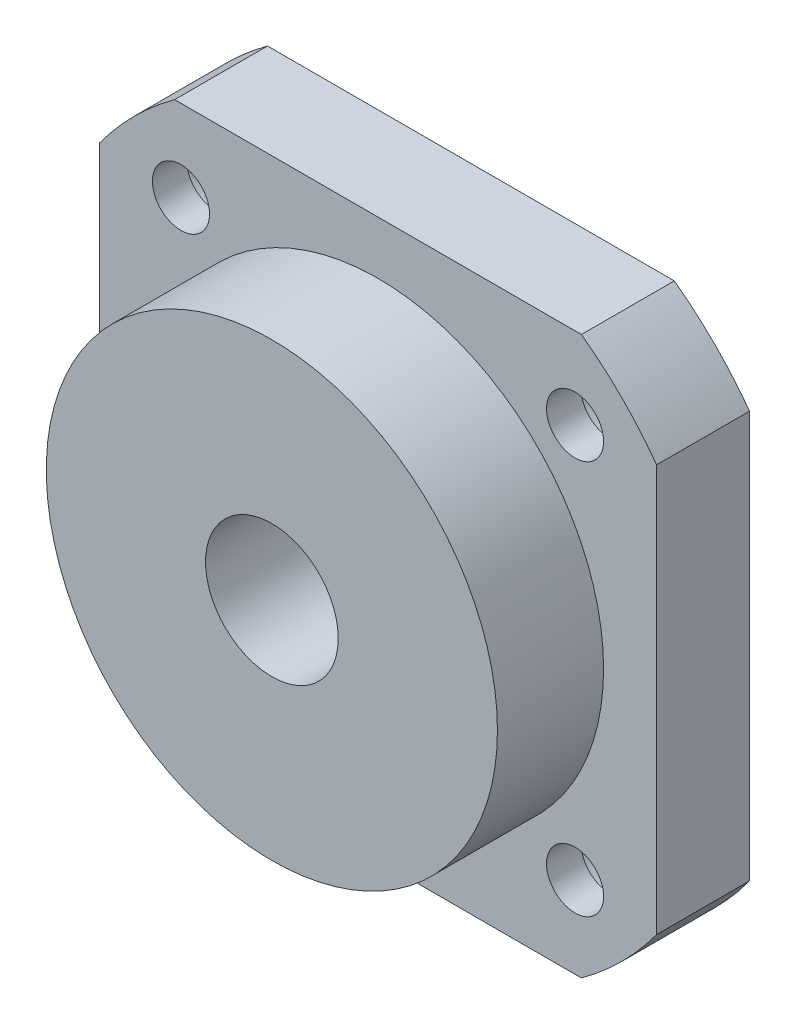
ISO-10303-21;
HEADER;
FILE_DESCRIPTION(('STEP AP214'),'2;1');
FILE_NAME('part.step','',(''),(''),'','','');
FILE_SCHEMA(('AUTOMOTIVE_DESIGN { 1 0 10303 214 1 1 1 1 }'));
ENDSEC;
DATA;
#1=APPLICATION_CONTEXT('core data for automotive mechanical design processes');
#2=APPLICATION_PROTOCOL_DEFINITION('international standard','automotive_design',2000,#1);
#3=PRODUCT_CONTEXT('',#1,'mechanical');
#4=PRODUCT('Part','Part','',(#3));
#5=PRODUCT_RELATED_PRODUCT_CATEGORY('part','',(#4));
#6=PRODUCT_DEFINITION_FORMATION('','',#4);
#7=PRODUCT_DEFINITION_CONTEXT('part definition',#1,'design');
#8=PRODUCT_DEFINITION('design','',#6,#7);
#9=PRODUCT_DEFINITION_SHAPE('','',#8);
#10=(LENGTH_UNIT() NAMED_UNIT(*) SI_UNIT(.MILLI.,.METRE.));
#11=(NAMED_UNIT(*) PLANE_ANGLE_UNIT() SI_UNIT($,.RADIAN.));
#12=(NAMED_UNIT(*) SI_UNIT($,.STERADIAN.) SOLID_ANGLE_UNIT());
#13=UNCERTAINTY_MEASURE_WITH_UNIT(LENGTH_MEASURE(1.E-05),#10,'distance_accuracy_value','');
#14=(GEOMETRIC_REPRESENTATION_CONTEXT(3) GLOBAL_UNCERTAINTY_ASSIGNED_CONTEXT((#13)) GLOBAL_UNIT_ASSIGNED_CONTEXT((#10,
#11,#12)) REPRESENTATION_CONTEXT('',''));
#15=CARTESIAN_POINT('',(0.,0.,0.));
#16=DIRECTION('',(0.,0.,1.));
#17=DIRECTION('',(1.,0.,0.));
#18=AXIS2_PLACEMENT_3D('',#15,#16,#17);
#19=CARTESIAN_POINT('',(0.,0.,15.));
#20=DIRECTION('',(0.,0.,1.));
#21=DIRECTION('',(1.,0.,0.));
#22=AXIS2_PLACEMENT_3D('',#19,#20,#21);
#23=PLANE('',#22);
#24=CARTESIAN_POINT('',(0.,0.,15.));
#25=DIRECTION('',(0.,0.,1.));
#26=DIRECTION('',(1.,0.,0.));
#27=AXIS2_PLACEMENT_3D('',#24,#25,#26);
#28=CIRCLE('',#27,5.);
#29=CARTESIAN_POINT('',(5.,0.,15.));
#30=VERTEX_POINT('',#29);
#31=EDGE_CURVE('E189',#30,#30,#28,.T.);
#32=ORIENTED_EDGE('',*,*,#31,.F.);
#33=EDGE_LOOP('',(#32));
#34=FACE_BOUND('',#33,.T.);
#35=CARTESIAN_POINT('',(0.,0.,15.));
#36=DIRECTION('',(0.,0.,1.));
#37=DIRECTION('',(1.,0.,0.));
#38=AXIS2_PLACEMENT_3D('',#35,#36,#37);
#39=CIRCLE('',#38,17.);
#40=CARTESIAN_POINT('',(17.,0.,15.));
#41=VERTEX_POINT('',#40);
#42=EDGE_CURVE('E138',#41,#41,#39,.T.);
#43=ORIENTED_EDGE('',*,*,#42,.T.);
#44=EDGE_LOOP('',(#43));
#45=FACE_BOUND('',#44,.T.);
#46=ADVANCED_FACE('F39',(#34,#45),#23,.T.);
#47=CARTESIAN_POINT('',(0.,0.,15.));
#48=DIRECTION('',(0.,0.,-1.));
#49=DIRECTION('',(-1.,0.,0.));
#50=AXIS2_PLACEMENT_3D('',#47,#48,#49);
#51=CYLINDRICAL_SURFACE('',#50,26.);
#52=CARTESIAN_POINT('',(0.,0.,7.));
#53=DIRECTION('',(0.,0.,1.));
#54=DIRECTION('',(1.,0.,0.));
#55=AXIS2_PLACEMENT_3D('',#52,#53,#54);
#56=CIRCLE('',#55,26.);
#57=CARTESIAN_POINT('',(21.,15.3297097167559,7.));
#58=VERTEX_POINT('',#57);
#59=CARTESIAN_POINT('',(15.3297097167559,21.,7.));
#60=VERTEX_POINT('',#59);
#61=EDGE_CURVE('E105',#58,#60,#56,.T.);
#62=ORIENTED_EDGE('',*,*,#61,.F.);
#63=DIRECTION('',(0.,0.,-1.));
#64=VECTOR('',#63,1.);
#65=CARTESIAN_POINT('',(21.,15.3297097167559,15.));
#66=LINE('',#65,#64);
#67=CARTESIAN_POINT('',(21.,15.3297097167559,0.));
#68=VERTEX_POINT('',#67);
#69=EDGE_CURVE('E63',#58,#68,#66,.T.);
#70=ORIENTED_EDGE('',*,*,#69,.T.);
#71=CARTESIAN_POINT('',(0.,0.,0.));
#72=DIRECTION('',(0.,0.,1.));
#73=DIRECTION('',(1.,0.,0.));
#74=AXIS2_PLACEMENT_3D('',#71,#72,#73);
#75=CIRCLE('',#74,26.);
#76=CARTESIAN_POINT('',(15.3297097167559,21.,0.));
#77=VERTEX_POINT('',#76);
#78=EDGE_CURVE('E192',#68,#77,#75,.T.);
#79=ORIENTED_EDGE('',*,*,#78,.T.);
#80=DIRECTION('',(0.,0.,-1.));
#81=VECTOR('',#80,1.);
#82=CARTESIAN_POINT('',(15.3297097167559,21.,15.));
#83=LINE('',#82,#81);
#84=EDGE_CURVE('E48',#60,#77,#83,.T.);
#85=ORIENTED_EDGE('',*,*,#84,.F.);
#86=EDGE_LOOP('',(#62,#70,#79,#85));
#87=FACE_BOUND('',#86,.T.);
#88=ADVANCED_FACE('F41',(#87),#51,.T.);
#89=CARTESIAN_POINT('',(15.3297097167559,21.,15.));
#90=DIRECTION('',(0.,-1.,0.));
#91=DIRECTION('',(1.,0.,0.));
#92=AXIS2_PLACEMENT_3D('',#89,#90,#91);
#93=PLANE('',#92);
#94=DIRECTION('',(-1.,0.,0.));
#95=VECTOR('',#94,1.);
#96=CARTESIAN_POINT('',(15.3297097167559,21.,7.));
#97=LINE('',#96,#95);
#98=CARTESIAN_POINT('',(-15.3297097167559,21.,7.));
#99=VERTEX_POINT('',#98);
#100=EDGE_CURVE('E111',#60,#99,#97,.T.);
#101=ORIENTED_EDGE('',*,*,#100,.F.);
#102=ORIENTED_EDGE('',*,*,#84,.T.);
#103=DIRECTION('',(-1.,0.,0.));
#104=VECTOR('',#103,1.);
#105=CARTESIAN_POINT('',(15.3297097167559,21.,0.));
#106=LINE('',#105,#104);
#107=CARTESIAN_POINT('',(-15.3297097167559,21.,0.));
#108=VERTEX_POINT('',#107);
#109=EDGE_CURVE('E196',#77,#108,#106,.T.);
#110=ORIENTED_EDGE('',*,*,#109,.T.);
#111=DIRECTION('',(0.,0.,-1.));
#112=VECTOR('',#111,1.);
#113=CARTESIAN_POINT('',(-15.3297097167559,21.,15.));
#114=LINE('',#113,#112);
#115=EDGE_CURVE('E132',#99,#108,#114,.T.);
#116=ORIENTED_EDGE('',*,*,#115,.F.);
#117=EDGE_LOOP('',(#101,#102,#110,#116));
#118=FACE_BOUND('',#117,.T.);
#119=ADVANCED_FACE('F224',(#118),#93,.F.);
#120=CARTESIAN_POINT('',(0.,0.,15.));
#121=DIRECTION('',(0.,0.,-1.));
#122=DIRECTION('',(-1.,0.,0.));
#123=AXIS2_PLACEMENT_3D('',#120,#121,#122);
#124=CYLINDRICAL_SURFACE('',#123,26.);
#125=CARTESIAN_POINT('',(0.,0.,7.));
#126=DIRECTION('',(0.,0.,1.));
#127=DIRECTION('',(1.,0.,0.));
#128=AXIS2_PLACEMENT_3D('',#125,#126,#127);
#129=CIRCLE('',#128,26.);
#130=CARTESIAN_POINT('',(-21.,15.3297097167559,7.));
#131=VERTEX_POINT('',#130);
#132=EDGE_CURVE('E186',#99,#131,#129,.T.);
#133=ORIENTED_EDGE('',*,*,#132,.F.);
#134=ORIENTED_EDGE('',*,*,#115,.T.);
#135=CARTESIAN_POINT('',(0.,0.,0.));
#136=DIRECTION('',(0.,0.,1.));
#137=DIRECTION('',(1.,0.,0.));
#138=AXIS2_PLACEMENT_3D('',#135,#136,#137);
#139=CIRCLE('',#138,26.);
#140=CARTESIAN_POINT('',(-21.,15.3297097167559,0.));
#141=VERTEX_POINT('',#140);
#142=EDGE_CURVE('E199',#108,#141,#139,.T.);
#143=ORIENTED_EDGE('',*,*,#142,.T.);
#144=DIRECTION('',(0.,0.,-1.));
#145=VECTOR('',#144,1.);
#146=CARTESIAN_POINT('',(-21.,15.3297097167559,15.));
#147=LINE('',#146,#145);
#148=EDGE_CURVE('E130',#131,#141,#147,.T.);
#149=ORIENTED_EDGE('',*,*,#148,.F.);
#150=EDGE_LOOP('',(#133,#134,#143,#149));
#151=FACE_BOUND('',#150,.T.);
#152=ADVANCED_FACE('F229',(#151),#124,.T.);
#153=CARTESIAN_POINT('',(-21.,-15.3297097167559,15.));
#154=DIRECTION('',(1.,0.,0.));
#155=DIRECTION('',(0.,0.,-1.));
#156=AXIS2_PLACEMENT_3D('',#153,#154,#155);
#157=PLANE('',#156);
#158=DIRECTION('',(0.,-1.,0.));
#159=VECTOR('',#158,1.);
#160=CARTESIAN_POINT('',(-21.,-15.3297097167559,7.));
#161=LINE('',#160,#159);
#162=CARTESIAN_POINT('',(-21.,-15.3297097167559,7.));
#163=VERTEX_POINT('',#162);
#164=EDGE_CURVE('E184',#131,#163,#161,.T.);
#165=ORIENTED_EDGE('',*,*,#164,.F.);
#166=ORIENTED_EDGE('',*,*,#148,.T.);
#167=DIRECTION('',(0.,-1.,0.));
#168=VECTOR('',#167,1.);
#169=CARTESIAN_POINT('',(-21.,-15.3297097167559,0.));
#170=LINE('',#169,#168);
#171=CARTESIAN_POINT('',(-21.,-15.3297097167559,0.));
#172=VERTEX_POINT('',#171);
#173=EDGE_CURVE('E202',#141,#172,#170,.T.);
#174=ORIENTED_EDGE('',*,*,#173,.T.);
#175=DIRECTION('',(0.,0.,-1.));
#176=VECTOR('',#175,1.);
#177=CARTESIAN_POINT('',(-21.,-15.3297097167559,15.));
#178=LINE('',#177,#176);
#179=EDGE_CURVE('E128',#163,#172,#178,.T.);
#180=ORIENTED_EDGE('',*,*,#179,.F.);
#181=EDGE_LOOP('',(#165,#166,#174,#180));
#182=FACE_BOUND('',#181,.T.);
#183=ADVANCED_FACE('F231',(#182),#157,.F.);
#184=CARTESIAN_POINT('',(0.,0.,15.));
#185=DIRECTION('',(0.,0.,-1.));
#186=DIRECTION('',(-1.,0.,0.));
#187=AXIS2_PLACEMENT_3D('',#184,#185,#186);
#188=CYLINDRICAL_SURFACE('',#187,26.);
#189=CARTESIAN_POINT('',(0.,0.,7.));
#190=DIRECTION('',(0.,0.,1.));
#191=DIRECTION('',(1.,0.,0.));
#192=AXIS2_PLACEMENT_3D('',#189,#190,#191);
#193=CIRCLE('',#192,26.);
#194=CARTESIAN_POINT('',(-15.3297097167559,-21.,7.));
#195=VERTEX_POINT('',#194);
#196=EDGE_CURVE('E182',#163,#195,#193,.T.);
#197=ORIENTED_EDGE('',*,*,#196,.F.);
#198=ORIENTED_EDGE('',*,*,#179,.T.);
#199=CARTESIAN_POINT('',(0.,0.,0.));
#200=DIRECTION('',(0.,0.,1.));
#201=DIRECTION('',(1.,0.,0.));
#202=AXIS2_PLACEMENT_3D('',#199,#200,#201);
#203=CIRCLE('',#202,26.);
#204=CARTESIAN_POINT('',(-15.3297097167559,-21.,0.));
#205=VERTEX_POINT('',#204);
#206=EDGE_CURVE('E205',#172,#205,#203,.T.);
#207=ORIENTED_EDGE('',*,*,#206,.T.);
#208=DIRECTION('',(0.,0.,-1.));
#209=VECTOR('',#208,1.);
#210=CARTESIAN_POINT('',(-15.3297097167559,-21.,15.));
#211=LINE('',#210,#209);
#212=EDGE_CURVE('E126',#195,#205,#211,.T.);
#213=ORIENTED_EDGE('',*,*,#212,.F.);
#214=EDGE_LOOP('',(#197,#198,#207,#213));
#215=FACE_BOUND('',#214,.T.);
#216=ADVANCED_FACE('F238',(#215),#188,.T.);
#217=CARTESIAN_POINT('',(15.3297097167559,-21.,15.));
#218=DIRECTION('',(0.,1.,0.));
#219=DIRECTION('',(0.,0.,1.));
#220=AXIS2_PLACEMENT_3D('',#217,#218,#219);
#221=PLANE('',#220);
#222=DIRECTION('',(1.,0.,0.));
#223=VECTOR('',#222,1.);
#224=CARTESIAN_POINT('',(15.3297097167559,-21.,7.));
#225=LINE('',#224,#223);
#226=CARTESIAN_POINT('',(15.3297097167559,-21.,7.));
#227=VERTEX_POINT('',#226);
#228=EDGE_CURVE('E180',#195,#227,#225,.T.);
#229=ORIENTED_EDGE('',*,*,#228,.F.);
#230=ORIENTED_EDGE('',*,*,#212,.T.);
#231=DIRECTION('',(1.,0.,0.));
#232=VECTOR('',#231,1.);
#233=CARTESIAN_POINT('',(15.3297097167559,-21.,0.));
#234=LINE('',#233,#232);
#235=CARTESIAN_POINT('',(15.3297097167559,-21.,0.));
#236=VERTEX_POINT('',#235);
#237=EDGE_CURVE('E208',#205,#236,#234,.T.);
#238=ORIENTED_EDGE('',*,*,#237,.T.);
#239=DIRECTION('',(0.,0.,-1.));
#240=VECTOR('',#239,1.);
#241=CARTESIAN_POINT('',(15.3297097167559,-21.,15.));
#242=LINE('',#241,#240);
#243=EDGE_CURVE('E119',#227,#236,#242,.T.);
#244=ORIENTED_EDGE('',*,*,#243,.F.);
#245=EDGE_LOOP('',(#229,#230,#238,#244));
#246=FACE_BOUND('',#245,.T.);
#247=ADVANCED_FACE('F240',(#246),#221,.F.);
#248=CARTESIAN_POINT('',(0.,0.,15.));
#249=DIRECTION('',(0.,0.,-1.));
#250=DIRECTION('',(-1.,0.,0.));
#251=AXIS2_PLACEMENT_3D('',#248,#249,#250);
#252=CYLINDRICAL_SURFACE('',#251,26.);
#253=CARTESIAN_POINT('',(0.,0.,7.));
#254=DIRECTION('',(0.,0.,1.));
#255=DIRECTION('',(1.,0.,0.));
#256=AXIS2_PLACEMENT_3D('',#253,#254,#255);
#257=CIRCLE('',#256,26.);
#258=CARTESIAN_POINT('',(21.,-15.3297097167559,7.));
#259=VERTEX_POINT('',#258);
#260=EDGE_CURVE('E55',#227,#259,#257,.T.);
#261=ORIENTED_EDGE('',*,*,#260,.F.);
#262=ORIENTED_EDGE('',*,*,#243,.T.);
#263=CARTESIAN_POINT('',(0.,0.,0.));
#264=DIRECTION('',(0.,0.,1.));
#265=DIRECTION('',(1.,0.,0.));
#266=AXIS2_PLACEMENT_3D('',#263,#264,#265);
#267=CIRCLE('',#266,26.);
#268=CARTESIAN_POINT('',(21.,-15.3297097167559,0.));
#269=VERTEX_POINT('',#268);
#270=EDGE_CURVE('E121',#236,#269,#267,.T.);
#271=ORIENTED_EDGE('',*,*,#270,.T.);
#272=DIRECTION('',(0.,0.,-1.));
#273=VECTOR('',#272,1.);
#274=CARTESIAN_POINT('',(21.,-15.3297097167559,15.));
#275=LINE('',#274,#273);
#276=EDGE_CURVE('E117',#259,#269,#275,.T.);
#277=ORIENTED_EDGE('',*,*,#276,.F.);
#278=EDGE_LOOP('',(#261,#262,#271,#277));
#279=FACE_BOUND('',#278,.T.);
#280=ADVANCED_FACE('F213',(#279),#252,.T.);
#281=CARTESIAN_POINT('',(21.,-15.3297097167559,15.));
#282=DIRECTION('',(-1.,0.,0.));
#283=DIRECTION('',(0.,-1.,0.));
#284=AXIS2_PLACEMENT_3D('',#281,#282,#283);
#285=PLANE('',#284);
#286=DIRECTION('',(0.,1.,0.));
#287=VECTOR('',#286,1.);
#288=CARTESIAN_POINT('',(21.,-15.3297097167559,7.));
#289=LINE('',#288,#287);
#290=EDGE_CURVE('E12',#259,#58,#289,.T.);
#291=ORIENTED_EDGE('',*,*,#290,.F.);
#292=ORIENTED_EDGE('',*,*,#276,.T.);
#293=DIRECTION('',(0.,1.,0.));
#294=VECTOR('',#293,1.);
#295=CARTESIAN_POINT('',(21.,-15.3297097167559,0.));
#296=LINE('',#295,#294);
#297=EDGE_CURVE('E115',#269,#68,#296,.T.);
#298=ORIENTED_EDGE('',*,*,#297,.T.);
#299=ORIENTED_EDGE('',*,*,#69,.F.);
#300=EDGE_LOOP('',(#291,#292,#298,#299));
#301=FACE_BOUND('',#300,.T.);
#302=ADVANCED_FACE('F113',(#301),#285,.F.);
#303=CARTESIAN_POINT('',(0.,0.,0.));
#304=DIRECTION('',(0.,0.,1.));
#305=DIRECTION('',(1.,0.,0.));
#306=AXIS2_PLACEMENT_3D('',#303,#304,#305);
#307=PLANE('',#306);
#308=CARTESIAN_POINT('',(-14.8492424049184,-14.8492424049166,0.));
#309=DIRECTION('',(0.,0.,-1.));
#310=DIRECTION('',(-1.,0.,0.));
#311=AXIS2_PLACEMENT_3D('',#308,#309,#310);
#312=CIRCLE('',#311,3.99999999999999);
#313=CARTESIAN_POINT('',(-18.8492424049183,-14.8492424049166,0.));
#314=VERTEX_POINT('',#313);
#315=EDGE_CURVE('E477',#314,#314,#312,.T.);
#316=ORIENTED_EDGE('',*,*,#315,.F.);
#317=EDGE_LOOP('',(#316));
#318=FACE_BOUND('',#317,.T.);
#319=CARTESIAN_POINT('',(14.8492424049166,-14.8492424049175,0.));
#320=DIRECTION('',(0.,0.,-1.));
#321=DIRECTION('',(-1.,0.,0.));
#322=AXIS2_PLACEMENT_3D('',#319,#320,#321);
#323=CIRCLE('',#322,3.99999999999999);
#324=CARTESIAN_POINT('',(10.8492424049166,-14.8492424049175,0.));
#325=VERTEX_POINT('',#324);
#326=EDGE_CURVE('E159',#325,#325,#323,.T.);
#327=ORIENTED_EDGE('',*,*,#326,.F.);
#328=EDGE_LOOP('',(#327));
#329=FACE_BOUND('',#328,.T.);
#330=CARTESIAN_POINT('',(14.8492424049175,14.8492424049175,0.));
#331=DIRECTION('',(0.,0.,-1.));
#332=DIRECTION('',(-1.,0.,0.));
#333=AXIS2_PLACEMENT_3D('',#330,#331,#332);
#334=CIRCLE('',#333,3.99999999999999);
#335=CARTESIAN_POINT('',(10.8492424049175,14.8492424049175,0.));
#336=VERTEX_POINT('',#335);
#337=EDGE_CURVE('E146',#336,#336,#334,.T.);
#338=ORIENTED_EDGE('',*,*,#337,.F.);
#339=EDGE_LOOP('',(#338));
#340=FACE_BOUND('',#339,.T.);
#341=CARTESIAN_POINT('',(-14.8492424049175,14.8492424049184,0.));
#342=DIRECTION('',(0.,0.,-1.));
#343=DIRECTION('',(-1.,0.,0.));
#344=AXIS2_PLACEMENT_3D('',#341,#342,#343);
#345=CIRCLE('',#344,3.99999999999999);
#346=CARTESIAN_POINT('',(-18.8492424049175,14.8492424049184,0.));
#347=VERTEX_POINT('',#346);
#348=EDGE_CURVE('E142',#347,#347,#345,.T.);
#349=ORIENTED_EDGE('',*,*,#348,.F.);
#350=EDGE_LOOP('',(#349));
#351=FACE_BOUND('',#350,.T.);
#352=ORIENTED_EDGE('',*,*,#78,.F.);
#353=ORIENTED_EDGE('',*,*,#297,.F.);
#354=ORIENTED_EDGE('',*,*,#270,.F.);
#355=ORIENTED_EDGE('',*,*,#237,.F.);
#356=ORIENTED_EDGE('',*,*,#206,.F.);
#357=ORIENTED_EDGE('',*,*,#173,.F.);
#358=ORIENTED_EDGE('',*,*,#142,.F.);
#359=ORIENTED_EDGE('',*,*,#109,.F.);
#360=EDGE_LOOP('',(#352,#353,#354,#355,#356,#357,#358,#359));
#361=FACE_BOUND('',#360,.T.);
#362=CARTESIAN_POINT('',(0.,0.,0.));
#363=DIRECTION('',(0.,0.,1.));
#364=DIRECTION('',(1.,0.,0.));
#365=AXIS2_PLACEMENT_3D('',#362,#363,#364);
#366=CIRCLE('',#365,5.);
#367=CARTESIAN_POINT('',(5.,0.,0.));
#368=VERTEX_POINT('',#367);
#369=EDGE_CURVE('E110',#368,#368,#366,.T.);
#370=ORIENTED_EDGE('',*,*,#369,.T.);
#371=EDGE_LOOP('',(#370));
#372=FACE_BOUND('',#371,.T.);
#373=ADVANCED_FACE('F217',(#318,#329,#340,#351,#361,#372),#307,.F.);
#374=CARTESIAN_POINT('',(0.,0.,15.));
#375=DIRECTION('',(0.,0.,-1.));
#376=DIRECTION('',(-1.,0.,0.));
#377=AXIS2_PLACEMENT_3D('',#374,#375,#376);
#378=CYLINDRICAL_SURFACE('',#377,5.);
#379=ORIENTED_EDGE('',*,*,#31,.T.);
#380=EDGE_LOOP('',(#379));
#381=FACE_BOUND('',#380,.T.);
#382=ORIENTED_EDGE('',*,*,#369,.F.);
#383=EDGE_LOOP('',(#382));
#384=FACE_BOUND('',#383,.T.);
#385=ADVANCED_FACE('F259',(#381,#384),#378,.F.);
#386=CARTESIAN_POINT('',(0.,0.,7.));
#387=DIRECTION('',(0.,0.,1.));
#388=DIRECTION('',(1.,0.,0.));
#389=AXIS2_PLACEMENT_3D('',#386,#387,#388);
#390=PLANE('',#389);
#391=CARTESIAN_POINT('',(-14.8492424049184,-14.8492424049166,7.));
#392=DIRECTION('',(0.,0.,1.));
#393=DIRECTION('',(1.,0.,0.));
#394=AXIS2_PLACEMENT_3D('',#391,#392,#393);
#395=CIRCLE('',#394,2.15);
#396=CARTESIAN_POINT('',(-12.6992424049184,-14.8492424049166,7.));
#397=VERTEX_POINT('',#396);
#398=EDGE_CURVE('E43',#397,#397,#395,.T.);
#399=ORIENTED_EDGE('',*,*,#398,.F.);
#400=EDGE_LOOP('',(#399));
#401=FACE_BOUND('',#400,.T.);
#402=CARTESIAN_POINT('',(14.8492424049166,-14.8492424049175,7.));
#403=DIRECTION('',(0.,0.,1.));
#404=DIRECTION('',(1.,0.,0.));
#405=AXIS2_PLACEMENT_3D('',#402,#403,#404);
#406=CIRCLE('',#405,2.15);
#407=CARTESIAN_POINT('',(16.9992424049166,-14.8492424049175,7.));
#408=VERTEX_POINT('',#407);
#409=EDGE_CURVE('E144',#408,#408,#406,.T.);
#410=ORIENTED_EDGE('',*,*,#409,.F.);
#411=EDGE_LOOP('',(#410));
#412=FACE_BOUND('',#411,.T.);
#413=CARTESIAN_POINT('',(14.8492424049175,14.8492424049175,7.));
#414=DIRECTION('',(0.,0.,1.));
#415=DIRECTION('',(1.,0.,0.));
#416=AXIS2_PLACEMENT_3D('',#413,#414,#415);
#417=CIRCLE('',#416,2.15);
#418=CARTESIAN_POINT('',(16.9992424049175,14.8492424049175,7.));
#419=VERTEX_POINT('',#418);
#420=EDGE_CURVE('E140',#419,#419,#417,.T.);
#421=ORIENTED_EDGE('',*,*,#420,.F.);
#422=EDGE_LOOP('',(#421));
#423=FACE_BOUND('',#422,.T.);
#424=CARTESIAN_POINT('',(-14.8492424049175,14.8492424049184,7.));
#425=DIRECTION('',(0.,0.,1.));
#426=DIRECTION('',(1.,0.,0.));
#427=AXIS2_PLACEMENT_3D('',#424,#425,#426);
#428=CIRCLE('',#427,2.15);
#429=CARTESIAN_POINT('',(-12.6992424049175,14.8492424049184,7.));
#430=VERTEX_POINT('',#429);
#431=EDGE_CURVE('E135',#430,#430,#428,.T.);
#432=ORIENTED_EDGE('',*,*,#431,.F.);
#433=EDGE_LOOP('',(#432));
#434=FACE_BOUND('',#433,.T.);
#435=CARTESIAN_POINT('',(0.,0.,7.));
#436=DIRECTION('',(0.,0.,1.));
#437=DIRECTION('',(1.,0.,0.));
#438=AXIS2_PLACEMENT_3D('',#435,#436,#437);
#439=CIRCLE('',#438,17.);
#440=CARTESIAN_POINT('',(17.,0.,7.));
#441=VERTEX_POINT('',#440);
#442=EDGE_CURVE('E174',#441,#441,#439,.T.);
#443=ORIENTED_EDGE('',*,*,#442,.F.);
#444=EDGE_LOOP('',(#443));
#445=FACE_BOUND('',#444,.T.);
#446=ORIENTED_EDGE('',*,*,#61,.T.);
#447=ORIENTED_EDGE('',*,*,#100,.T.);
#448=ORIENTED_EDGE('',*,*,#132,.T.);
#449=ORIENTED_EDGE('',*,*,#164,.T.);
#450=ORIENTED_EDGE('',*,*,#196,.T.);
#451=ORIENTED_EDGE('',*,*,#228,.T.);
#452=ORIENTED_EDGE('',*,*,#260,.T.);
#453=ORIENTED_EDGE('',*,*,#290,.T.);
#454=EDGE_LOOP('',(#446,#447,#448,#449,#450,#451,#452,#453));
#455=FACE_BOUND('',#454,.T.);
#456=ADVANCED_FACE('F104',(#401,#412,#423,#434,#445,#455),#390,.T.);
#457=CARTESIAN_POINT('',(0.,0.,7.));
#458=DIRECTION('',(0.,0.,1.));
#459=DIRECTION('',(1.,0.,0.));
#460=AXIS2_PLACEMENT_3D('',#457,#458,#459);
#461=CYLINDRICAL_SURFACE('',#460,17.);
#462=ORIENTED_EDGE('',*,*,#442,.T.);
#463=EDGE_LOOP('',(#462));
#464=FACE_BOUND('',#463,.T.);
#465=ORIENTED_EDGE('',*,*,#42,.F.);
#466=EDGE_LOOP('',(#465));
#467=FACE_BOUND('',#466,.T.);
#468=ADVANCED_FACE('F287',(#464,#467),#461,.T.);
#469=CARTESIAN_POINT('',(-14.8492424049175,14.8492424049184,0.));
#470=DIRECTION('',(0.,0.,-1.));
#471=DIRECTION('',(-1.,0.,0.));
#472=AXIS2_PLACEMENT_3D('',#469,#470,#471);
#473=CYLINDRICAL_SURFACE('',#472,2.15);
#474=ORIENTED_EDGE('',*,*,#431,.T.);
#475=EDGE_LOOP('',(#474));
#476=FACE_BOUND('',#475,.T.);
#477=CARTESIAN_POINT('',(-14.8492424049175,14.8492424049184,4.4));
#478=DIRECTION('',(0.,0.,-1.));
#479=DIRECTION('',(-1.,0.,0.));
#480=AXIS2_PLACEMENT_3D('',#477,#478,#479);
#481=CIRCLE('',#480,2.15);
#482=CARTESIAN_POINT('',(-16.9992424049175,14.8492424049184,4.4));
#483=VERTEX_POINT('',#482);
#484=EDGE_CURVE('E139',#483,#483,#481,.T.);
#485=ORIENTED_EDGE('',*,*,#484,.T.);
#486=EDGE_LOOP('',(#485));
#487=FACE_BOUND('',#486,.T.);
#488=ADVANCED_FACE('F294',(#476,#487),#473,.F.);
#489=CARTESIAN_POINT('',(-12.6992424049175,14.8492424049184,4.4));
#490=DIRECTION('',(0.,0.,1.));
#491=DIRECTION('',(1.,0.,0.));
#492=AXIS2_PLACEMENT_3D('',#489,#490,#491);
#493=PLANE('',#492);
#494=ORIENTED_EDGE('',*,*,#484,.F.);
#495=EDGE_LOOP('',(#494));
#496=FACE_BOUND('',#495,.T.);
#497=CARTESIAN_POINT('',(-14.8492424049175,14.8492424049184,4.4));
#498=DIRECTION('',(0.,0.,-1.));
#499=DIRECTION('',(-1.,0.,0.));
#500=AXIS2_PLACEMENT_3D('',#497,#498,#499);
#501=CIRCLE('',#500,4.);
#502=CARTESIAN_POINT('',(-18.8492424049175,14.8492424049184,4.4));
#503=VERTEX_POINT('',#502);
#504=EDGE_CURVE('E169',#503,#503,#501,.T.);
#505=ORIENTED_EDGE('',*,*,#504,.T.);
#506=EDGE_LOOP('',(#505));
#507=FACE_BOUND('',#506,.T.);
#508=ADVANCED_FACE('F302',(#496,#507),#493,.F.);
#509=CARTESIAN_POINT('',(-14.8492424049175,14.8492424049184,0.));
#510=DIRECTION('',(0.,0.,-1.));
#511=DIRECTION('',(-1.,0.,0.));
#512=AXIS2_PLACEMENT_3D('',#509,#510,#511);
#513=CYLINDRICAL_SURFACE('',#512,3.99999999999999);
#514=ORIENTED_EDGE('',*,*,#504,.F.);
#515=EDGE_LOOP('',(#514));
#516=FACE_BOUND('',#515,.T.);
#517=ORIENTED_EDGE('',*,*,#348,.T.);
#518=EDGE_LOOP('',(#517));
#519=FACE_BOUND('',#518,.T.);
#520=ADVANCED_FACE('F310',(#516,#519),#513,.F.);
#521=CARTESIAN_POINT('',(14.8492424049175,14.8492424049175,0.));
#522=DIRECTION('',(0.,0.,-1.));
#523=DIRECTION('',(-1.,0.,0.));
#524=AXIS2_PLACEMENT_3D('',#521,#522,#523);
#525=CYLINDRICAL_SURFACE('',#524,2.15);
#526=ORIENTED_EDGE('',*,*,#420,.T.);
#527=EDGE_LOOP('',(#526));
#528=FACE_BOUND('',#527,.T.);
#529=CARTESIAN_POINT('',(14.8492424049175,14.8492424049175,4.4));
#530=DIRECTION('',(0.,0.,-1.));
#531=DIRECTION('',(-1.,0.,0.));
#532=AXIS2_PLACEMENT_3D('',#529,#530,#531);
#533=CIRCLE('',#532,2.15);
#534=CARTESIAN_POINT('',(12.6992424049175,14.8492424049175,4.4));
#535=VERTEX_POINT('',#534);
#536=EDGE_CURVE('E143',#535,#535,#533,.T.);
#537=ORIENTED_EDGE('',*,*,#536,.T.);
#538=EDGE_LOOP('',(#537));
#539=FACE_BOUND('',#538,.T.);
#540=ADVANCED_FACE('F318',(#528,#539),#525,.F.);
#541=CARTESIAN_POINT('',(16.9992424049175,14.8492424049175,4.4));
#542=DIRECTION('',(0.,0.,1.));
#543=DIRECTION('',(1.,0.,0.));
#544=AXIS2_PLACEMENT_3D('',#541,#542,#543);
#545=PLANE('',#544);
#546=ORIENTED_EDGE('',*,*,#536,.F.);
#547=EDGE_LOOP('',(#546));
#548=FACE_BOUND('',#547,.T.);
#549=CARTESIAN_POINT('',(14.8492424049175,14.8492424049175,4.4));
#550=DIRECTION('',(0.,0.,-1.));
#551=DIRECTION('',(-1.,0.,0.));
#552=AXIS2_PLACEMENT_3D('',#549,#550,#551);
#553=CIRCLE('',#552,3.99999999999999);
#554=CARTESIAN_POINT('',(10.8492424049175,14.8492424049175,4.4));
#555=VERTEX_POINT('',#554);
#556=EDGE_CURVE('E151',#555,#555,#553,.T.);
#557=ORIENTED_EDGE('',*,*,#556,.T.);
#558=EDGE_LOOP('',(#557));
#559=FACE_BOUND('',#558,.T.);
#560=ADVANCED_FACE('F326',(#548,#559),#545,.F.);
#561=CARTESIAN_POINT('',(14.8492424049175,14.8492424049175,0.));
#562=DIRECTION('',(0.,0.,-1.));
#563=DIRECTION('',(-1.,0.,0.));
#564=AXIS2_PLACEMENT_3D('',#561,#562,#563);
#565=CYLINDRICAL_SURFACE('',#564,3.99999999999999);
#566=ORIENTED_EDGE('',*,*,#556,.F.);
#567=EDGE_LOOP('',(#566));
#568=FACE_BOUND('',#567,.T.);
#569=ORIENTED_EDGE('',*,*,#337,.T.);
#570=EDGE_LOOP('',(#569));
#571=FACE_BOUND('',#570,.T.);
#572=ADVANCED_FACE('F334',(#568,#571),#565,.F.);
#573=CARTESIAN_POINT('',(14.8492424049166,-14.8492424049175,0.));
#574=DIRECTION('',(0.,0.,-1.));
#575=DIRECTION('',(-1.,0.,0.));
#576=AXIS2_PLACEMENT_3D('',#573,#574,#575);
#577=CYLINDRICAL_SURFACE('',#576,2.15);
#578=ORIENTED_EDGE('',*,*,#409,.T.);
#579=EDGE_LOOP('',(#578));
#580=FACE_BOUND('',#579,.T.);
#581=CARTESIAN_POINT('',(14.8492424049166,-14.8492424049175,4.4));
#582=DIRECTION('',(0.,0.,-1.));
#583=DIRECTION('',(-1.,0.,0.));
#584=AXIS2_PLACEMENT_3D('',#581,#582,#583);
#585=CIRCLE('',#584,2.15);
#586=CARTESIAN_POINT('',(12.6992424049166,-14.8492424049175,4.4));
#587=VERTEX_POINT('',#586);
#588=EDGE_CURVE('E147',#587,#587,#585,.T.);
#589=ORIENTED_EDGE('',*,*,#588,.T.);
#590=EDGE_LOOP('',(#589));
#591=FACE_BOUND('',#590,.T.);
#592=ADVANCED_FACE('F342',(#580,#591),#577,.F.);
#593=CARTESIAN_POINT('',(16.9992424049166,-14.8492424049175,4.4));
#594=DIRECTION('',(0.,0.,1.));
#595=DIRECTION('',(1.,0.,0.));
#596=AXIS2_PLACEMENT_3D('',#593,#594,#595);
#597=PLANE('',#596);
#598=ORIENTED_EDGE('',*,*,#588,.F.);
#599=EDGE_LOOP('',(#598));
#600=FACE_BOUND('',#599,.T.);
#601=CARTESIAN_POINT('',(14.8492424049166,-14.8492424049175,4.4));
#602=DIRECTION('',(0.,0.,-1.));
#603=DIRECTION('',(-1.,0.,0.));
#604=AXIS2_PLACEMENT_3D('',#601,#602,#603);
#605=CIRCLE('',#604,3.99999999999999);
#606=CARTESIAN_POINT('',(10.8492424049166,-14.8492424049175,4.4));
#607=VERTEX_POINT('',#606);
#608=EDGE_CURVE('E154',#607,#607,#605,.T.);
#609=ORIENTED_EDGE('',*,*,#608,.T.);
#610=EDGE_LOOP('',(#609));
#611=FACE_BOUND('',#610,.T.);
#612=ADVANCED_FACE('F350',(#600,#611),#597,.F.);
#613=CARTESIAN_POINT('',(14.8492424049166,-14.8492424049175,0.));
#614=DIRECTION('',(0.,0.,-1.));
#615=DIRECTION('',(-1.,0.,0.));
#616=AXIS2_PLACEMENT_3D('',#613,#614,#615);
#617=CYLINDRICAL_SURFACE('',#616,3.99999999999999);
#618=ORIENTED_EDGE('',*,*,#608,.F.);
#619=EDGE_LOOP('',(#618));
#620=FACE_BOUND('',#619,.T.);
#621=ORIENTED_EDGE('',*,*,#326,.T.);
#622=EDGE_LOOP('',(#621));
#623=FACE_BOUND('',#622,.T.);
#624=ADVANCED_FACE('F357',(#620,#623),#617,.F.);
#625=CARTESIAN_POINT('',(-14.8492424049184,-14.8492424049166,0.));
#626=DIRECTION('',(0.,0.,-1.));
#627=DIRECTION('',(-1.,0.,0.));
#628=AXIS2_PLACEMENT_3D('',#625,#626,#627);
#629=CYLINDRICAL_SURFACE('',#628,2.15);
#630=ORIENTED_EDGE('',*,*,#398,.T.);
#631=EDGE_LOOP('',(#630));
#632=FACE_BOUND('',#631,.T.);
#633=CARTESIAN_POINT('',(-14.8492424049184,-14.8492424049166,4.4));
#634=DIRECTION('',(0.,0.,-1.));
#635=DIRECTION('',(-1.,0.,0.));
#636=AXIS2_PLACEMENT_3D('',#633,#634,#635);
#637=CIRCLE('',#636,2.15);
#638=CARTESIAN_POINT('',(-16.9992424049184,-14.8492424049166,4.4));
#639=VERTEX_POINT('',#638);
#640=EDGE_CURVE('E479',#639,#639,#637,.T.);
#641=ORIENTED_EDGE('',*,*,#640,.T.);
#642=EDGE_LOOP('',(#641));
#643=FACE_BOUND('',#642,.T.);
#644=ADVANCED_FACE('F364',(#632,#643),#629,.F.);
#645=CARTESIAN_POINT('',(-12.6992424049183,-14.8492424049166,4.4));
#646=DIRECTION('',(0.,0.,1.));
#647=DIRECTION('',(1.,0.,0.));
#648=AXIS2_PLACEMENT_3D('',#645,#646,#647);
#649=PLANE('',#648);
#650=ORIENTED_EDGE('',*,*,#640,.F.);
#651=EDGE_LOOP('',(#650));
#652=FACE_BOUND('',#651,.T.);
#653=CARTESIAN_POINT('',(-14.8492424049184,-14.8492424049166,4.4));
#654=DIRECTION('',(0.,0.,-1.));
#655=DIRECTION('',(-1.,0.,0.));
#656=AXIS2_PLACEMENT_3D('',#653,#654,#655);
#657=CIRCLE('',#656,3.99999999999999);
#658=CARTESIAN_POINT('',(-18.8492424049183,-14.8492424049166,4.4));
#659=VERTEX_POINT('',#658);
#660=EDGE_CURVE('E474',#659,#659,#657,.T.);
#661=ORIENTED_EDGE('',*,*,#660,.T.);
#662=EDGE_LOOP('',(#661));
#663=FACE_BOUND('',#662,.T.);
#664=ADVANCED_FACE('F371',(#652,#663),#649,.F.);
#665=CARTESIAN_POINT('',(-14.8492424049184,-14.8492424049166,0.));
#666=DIRECTION('',(0.,0.,-1.));
#667=DIRECTION('',(-1.,0.,0.));
#668=AXIS2_PLACEMENT_3D('',#665,#666,#667);
#669=CYLINDRICAL_SURFACE('',#668,3.99999999999999);
#670=ORIENTED_EDGE('',*,*,#660,.F.);
#671=EDGE_LOOP('',(#670));
#672=FACE_BOUND('',#671,.T.);
#673=ORIENTED_EDGE('',*,*,#315,.T.);
#674=EDGE_LOOP('',(#673));
#675=FACE_BOUND('',#674,.T.);
#676=ADVANCED_FACE('F379',(#672,#675),#669,.F.);
#677=CLOSED_SHELL('',(#46,#88,#119,#152,#183,#216,#247,#280,#302,#373,#385,#456,#468,#488,#508,
#520,#540,#560,#572,#592,#612,#624,#644,#664,#676));
#678=MANIFOLD_SOLID_BREP('B2',#677);
#679=ADVANCED_BREP_SHAPE_REPRESENTATION('',(#18,#678),#14);
#680=SHAPE_DEFINITION_REPRESENTATION(#9,#679);
ENDSEC;
END-ISO-10303-21;
